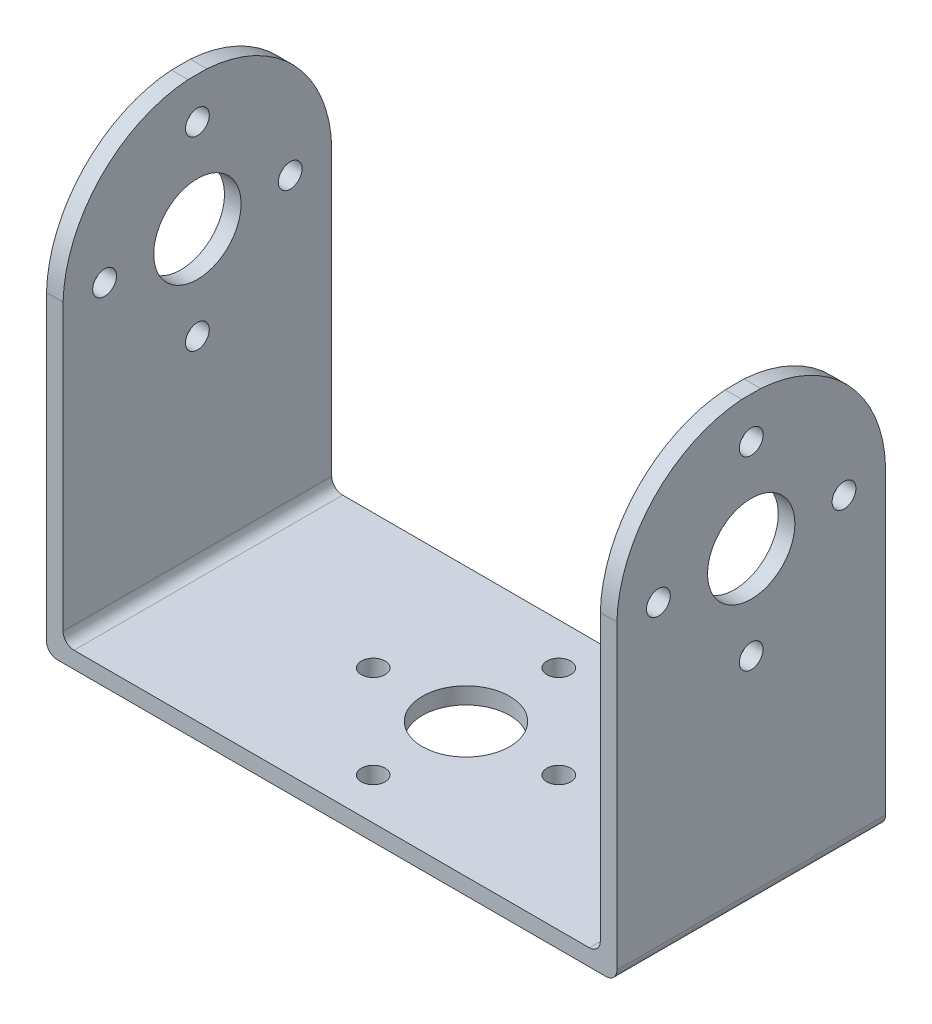
ISO-10303-21;
HEADER;
FILE_DESCRIPTION(('STEP AP214'),'2;1');
FILE_NAME('part.step','',(''),(''),'','','');
FILE_SCHEMA(('AUTOMOTIVE_DESIGN { 1 0 10303 214 1 1 1 1 }'));
ENDSEC;
DATA;
#1=APPLICATION_CONTEXT('core data for automotive mechanical design processes');
#2=APPLICATION_PROTOCOL_DEFINITION('international standard','automotive_design',2000,#1);
#3=PRODUCT_CONTEXT('',#1,'mechanical');
#4=PRODUCT('Part','Part','',(#3));
#5=PRODUCT_RELATED_PRODUCT_CATEGORY('part','',(#4));
#6=PRODUCT_DEFINITION_FORMATION('','',#4);
#7=PRODUCT_DEFINITION_CONTEXT('part definition',#1,'design');
#8=PRODUCT_DEFINITION('design','',#6,#7);
#9=PRODUCT_DEFINITION_SHAPE('','',#8);
#10=(LENGTH_UNIT() NAMED_UNIT(*) SI_UNIT(.MILLI.,.METRE.));
#11=(NAMED_UNIT(*) PLANE_ANGLE_UNIT() SI_UNIT($,.RADIAN.));
#12=(NAMED_UNIT(*) SI_UNIT($,.STERADIAN.) SOLID_ANGLE_UNIT());
#13=UNCERTAINTY_MEASURE_WITH_UNIT(LENGTH_MEASURE(1.E-05),#10,'distance_accuracy_value','');
#14=(GEOMETRIC_REPRESENTATION_CONTEXT(3) GLOBAL_UNCERTAINTY_ASSIGNED_CONTEXT((#13)) GLOBAL_UNIT_ASSIGNED_CONTEXT((#10,
#11,#12)) REPRESENTATION_CONTEXT('',''));
#15=CARTESIAN_POINT('',(0.,0.,0.));
#16=DIRECTION('',(0.,0.,1.));
#17=DIRECTION('',(1.,0.,0.));
#18=AXIS2_PLACEMENT_3D('',#15,#16,#17);
#19=CARTESIAN_POINT('',(0.,0.,24.61));
#20=DIRECTION('',(0.,0.,1.));
#21=DIRECTION('',(1.,0.,0.));
#22=AXIS2_PLACEMENT_3D('',#19,#20,#21);
#23=PLANE('',#22);
#24=DIRECTION('',(1.,0.,0.));
#25=VECTOR('',#24,1.);
#26=CARTESIAN_POINT('',(-26.125,0.,24.61));
#27=LINE('',#26,#25);
#28=CARTESIAN_POINT('',(-25.125,0.,24.61));
#29=VERTEX_POINT('',#28);
#30=CARTESIAN_POINT('',(25.125,0.,24.61));
#31=VERTEX_POINT('',#30);
#32=EDGE_CURVE('E230',#29,#31,#27,.T.);
#33=ORIENTED_EDGE('',*,*,#32,.T.);
#34=CARTESIAN_POINT('',(25.125,1.,24.61));
#35=DIRECTION('',(0.,0.,1.));
#36=DIRECTION('',(1.,0.,0.));
#37=AXIS2_PLACEMENT_3D('',#34,#35,#36);
#38=CIRCLE('',#37,1.);
#39=CARTESIAN_POINT('',(26.125,1.,24.61));
#40=VERTEX_POINT('',#39);
#41=EDGE_CURVE('E303',#31,#40,#38,.T.);
#42=ORIENTED_EDGE('',*,*,#41,.T.);
#43=DIRECTION('',(0.,1.,0.));
#44=VECTOR('',#43,1.);
#45=CARTESIAN_POINT('',(26.125,0.,24.61));
#46=LINE('',#45,#44);
#47=CARTESIAN_POINT('',(26.125,28.630820466906,24.61));
#48=VERTEX_POINT('',#47);
#49=EDGE_CURVE('E234',#40,#48,#46,.T.);
#50=ORIENTED_EDGE('',*,*,#49,.T.);
#51=DIRECTION('',(1.,0.,0.));
#52=VECTOR('',#51,1.);
#53=CARTESIAN_POINT('',(6.125,28.630820466906,24.61));
#54=LINE('',#53,#52);
#55=CARTESIAN_POINT('',(24.605,28.630820466906,24.61));
#56=VERTEX_POINT('',#55);
#57=EDGE_CURVE('E350',#56,#48,#54,.T.);
#58=ORIENTED_EDGE('',*,*,#57,.F.);
#59=DIRECTION('',(0.,-1.,0.));
#60=VECTOR('',#59,1.);
#61=CARTESIAN_POINT('',(24.605,58.34,24.61));
#62=LINE('',#61,#60);
#63=CARTESIAN_POINT('',(24.605,2.52,24.61));
#64=VERTEX_POINT('',#63);
#65=EDGE_CURVE('E236',#56,#64,#62,.T.);
#66=ORIENTED_EDGE('',*,*,#65,.T.);
#67=CARTESIAN_POINT('',(23.605,2.52,24.61));
#68=DIRECTION('',(0.,0.,1.));
#69=DIRECTION('',(1.,0.,0.));
#70=AXIS2_PLACEMENT_3D('',#67,#68,#69);
#71=CIRCLE('',#70,1.);
#72=CARTESIAN_POINT('',(23.605,1.52,24.61));
#73=VERTEX_POINT('',#72);
#74=EDGE_CURVE('E318',#64,#73,#71,.F.);
#75=ORIENTED_EDGE('',*,*,#74,.T.);
#76=DIRECTION('',(-1.,0.,0.));
#77=VECTOR('',#76,1.);
#78=CARTESIAN_POINT('',(24.605,1.52,24.61));
#79=LINE('',#78,#77);
#80=CARTESIAN_POINT('',(-23.605,1.51999999999999,24.61));
#81=VERTEX_POINT('',#80);
#82=EDGE_CURVE('E239',#73,#81,#79,.T.);
#83=ORIENTED_EDGE('',*,*,#82,.T.);
#84=CARTESIAN_POINT('',(-23.605,2.51999999999999,24.61));
#85=DIRECTION('',(0.,0.,1.));
#86=DIRECTION('',(1.,0.,0.));
#87=AXIS2_PLACEMENT_3D('',#84,#85,#86);
#88=CIRCLE('',#87,1.);
#89=CARTESIAN_POINT('',(-24.605,2.51999999999999,24.61));
#90=VERTEX_POINT('',#89);
#91=EDGE_CURVE('E12',#81,#90,#88,.F.);
#92=ORIENTED_EDGE('',*,*,#91,.T.);
#93=DIRECTION('',(0.,1.,0.));
#94=VECTOR('',#93,1.);
#95=CARTESIAN_POINT('',(-24.605,1.51999999999999,24.61));
#96=LINE('',#95,#94);
#97=CARTESIAN_POINT('',(-24.605,28.630820466906,24.61));
#98=VERTEX_POINT('',#97);
#99=EDGE_CURVE('E241',#90,#98,#96,.T.);
#100=ORIENTED_EDGE('',*,*,#99,.T.);
#101=DIRECTION('',(-1.,0.,0.));
#102=VECTOR('',#101,1.);
#103=CARTESIAN_POINT('',(-6.125,28.630820466906,24.61));
#104=LINE('',#103,#102);
#105=CARTESIAN_POINT('',(-26.125,28.630820466906,24.61));
#106=VERTEX_POINT('',#105);
#107=EDGE_CURVE('E257',#98,#106,#104,.T.);
#108=ORIENTED_EDGE('',*,*,#107,.T.);
#109=DIRECTION('',(0.,-1.,0.));
#110=VECTOR('',#109,1.);
#111=CARTESIAN_POINT('',(-26.125,58.34,24.61));
#112=LINE('',#111,#110);
#113=CARTESIAN_POINT('',(-26.125,1.00000000000001,24.61));
#114=VERTEX_POINT('',#113);
#115=EDGE_CURVE('E228',#106,#114,#112,.T.);
#116=ORIENTED_EDGE('',*,*,#115,.T.);
#117=CARTESIAN_POINT('',(-25.125,1.,24.61));
#118=DIRECTION('',(0.,0.,1.));
#119=DIRECTION('',(1.,0.,0.));
#120=AXIS2_PLACEMENT_3D('',#117,#118,#119);
#121=CIRCLE('',#120,1.);
#122=EDGE_CURVE('E301',#114,#29,#121,.T.);
#123=ORIENTED_EDGE('',*,*,#122,.T.);
#124=EDGE_LOOP('',(#33,#42,#50,#58,#66,#75,#83,#92,#100,#108,#116,#123));
#125=FACE_BOUND('',#124,.T.);
#126=ADVANCED_FACE('F82',(#125),#23,.T.);
#127=CARTESIAN_POINT('',(-26.125,58.34,24.61));
#128=DIRECTION('',(1.,0.,0.));
#129=DIRECTION('',(0.,1.,0.));
#130=AXIS2_PLACEMENT_3D('',#127,#128,#129);
#131=PLANE('',#130);
#132=CARTESIAN_POINT('',(-26.125,28.2800000000001,20.805));
#133=DIRECTION('',(-1.,0.,0.));
#134=DIRECTION('',(0.,0.,-1.));
#135=AXIS2_PLACEMENT_3D('',#132,#133,#134);
#136=CIRCLE('',#135,1.09);
#137=CARTESIAN_POINT('',(-26.125,28.2800000000001,19.715));
#138=VERTEX_POINT('',#137);
#139=EDGE_CURVE('E381',#138,#138,#136,.T.);
#140=ORIENTED_EDGE('',*,*,#139,.F.);
#141=EDGE_LOOP('',(#140));
#142=FACE_BOUND('',#141,.T.);
#143=CARTESIAN_POINT('',(-26.125,19.78,12.305));
#144=DIRECTION('',(-1.,0.,0.));
#145=DIRECTION('',(0.,1.,0.));
#146=AXIS2_PLACEMENT_3D('',#143,#144,#145);
#147=CIRCLE('',#146,1.09);
#148=CARTESIAN_POINT('',(-26.125,20.87,12.305));
#149=VERTEX_POINT('',#148);
#150=EDGE_CURVE('E375',#149,#149,#147,.T.);
#151=ORIENTED_EDGE('',*,*,#150,.F.);
#152=EDGE_LOOP('',(#151));
#153=FACE_BOUND('',#152,.T.);
#154=CARTESIAN_POINT('',(-26.125,28.28,3.805));
#155=DIRECTION('',(-1.,0.,0.));
#156=DIRECTION('',(0.,0.,1.));
#157=AXIS2_PLACEMENT_3D('',#154,#155,#156);
#158=CIRCLE('',#157,1.09);
#159=CARTESIAN_POINT('',(-26.125,28.28,4.895));
#160=VERTEX_POINT('',#159);
#161=EDGE_CURVE('E369',#160,#160,#158,.T.);
#162=ORIENTED_EDGE('',*,*,#161,.F.);
#163=EDGE_LOOP('',(#162));
#164=FACE_BOUND('',#163,.T.);
#165=CARTESIAN_POINT('',(-26.125,36.78,12.305));
#166=DIRECTION('',(-1.,0.,0.));
#167=DIRECTION('',(0.,-1.,0.));
#168=AXIS2_PLACEMENT_3D('',#165,#166,#167);
#169=CIRCLE('',#168,1.09);
#170=CARTESIAN_POINT('',(-26.125,35.69,12.305));
#171=VERTEX_POINT('',#170);
#172=EDGE_CURVE('E280',#171,#171,#169,.T.);
#173=ORIENTED_EDGE('',*,*,#172,.F.);
#174=EDGE_LOOP('',(#173));
#175=FACE_BOUND('',#174,.T.);
#176=CARTESIAN_POINT('',(-26.125,28.28,12.305));
#177=DIRECTION('',(-1.,0.,0.));
#178=DIRECTION('',(0.,0.,1.));
#179=AXIS2_PLACEMENT_3D('',#176,#177,#178);
#180=CIRCLE('',#179,4.);
#181=CARTESIAN_POINT('',(-26.125,28.28,16.305));
#182=VERTEX_POINT('',#181);
#183=EDGE_CURVE('E264',#182,#182,#180,.T.);
#184=ORIENTED_EDGE('',*,*,#183,.F.);
#185=EDGE_LOOP('',(#184));
#186=FACE_BOUND('',#185,.T.);
#187=CARTESIAN_POINT('',(-26.125,28.28,12.305));
#188=DIRECTION('',(-1.,0.,0.));
#189=DIRECTION('',(0.,0.,1.));
#190=AXIS2_PLACEMENT_3D('',#187,#188,#189);
#191=CIRCLE('',#190,12.31);
#192=CARTESIAN_POINT('',(-26.125,40.56,13.1638946384744));
#193=VERTEX_POINT('',#192);
#194=EDGE_CURVE('E213',#106,#193,#191,.T.);
#195=ORIENTED_EDGE('',*,*,#194,.T.);
#196=DIRECTION('',(0.,0.,1.));
#197=VECTOR('',#196,1.);
#198=CARTESIAN_POINT('',(-26.125,40.56,0.));
#199=LINE('',#198,#197);
#200=CARTESIAN_POINT('',(-26.125,40.56,11.4461053615256));
#201=VERTEX_POINT('',#200);
#202=EDGE_CURVE('E198',#201,#193,#199,.T.);
#203=ORIENTED_EDGE('',*,*,#202,.F.);
#204=CARTESIAN_POINT('',(-26.125,28.28,12.305));
#205=DIRECTION('',(-1.,0.,0.));
#206=DIRECTION('',(0.,0.,1.));
#207=AXIS2_PLACEMENT_3D('',#204,#205,#206);
#208=CIRCLE('',#207,12.31);
#209=CARTESIAN_POINT('',(-26.125,28.6308204669058,0.));
#210=VERTEX_POINT('',#209);
#211=EDGE_CURVE('E207',#201,#210,#208,.T.);
#212=ORIENTED_EDGE('',*,*,#211,.T.);
#213=DIRECTION('',(0.,-1.,0.));
#214=VECTOR('',#213,1.);
#215=CARTESIAN_POINT('',(-26.125,58.34,0.));
#216=LINE('',#215,#214);
#217=CARTESIAN_POINT('',(-26.125,1.00000000000001,0.));
#218=VERTEX_POINT('',#217);
#219=EDGE_CURVE('E227',#210,#218,#216,.T.);
#220=ORIENTED_EDGE('',*,*,#219,.T.);
#221=DIRECTION('',(0.,0.,-1.));
#222=VECTOR('',#221,1.);
#223=CARTESIAN_POINT('',(-26.125,1.,24.61));
#224=LINE('',#223,#222);
#225=EDGE_CURVE('E97',#218,#114,#224,.F.);
#226=ORIENTED_EDGE('',*,*,#225,.T.);
#227=ORIENTED_EDGE('',*,*,#115,.F.);
#228=EDGE_LOOP('',(#195,#203,#212,#220,#226,#227));
#229=FACE_BOUND('',#228,.T.);
#230=ADVANCED_FACE('F211',(#142,#153,#164,#175,#186,#229),#131,.F.);
#231=CARTESIAN_POINT('',(-24.605,1.51999999999999,24.61));
#232=DIRECTION('',(-1.,0.,0.));
#233=DIRECTION('',(0.,-1.,0.));
#234=AXIS2_PLACEMENT_3D('',#231,#232,#233);
#235=PLANE('',#234);
#236=CARTESIAN_POINT('',(-24.605,28.2800000000001,20.805));
#237=DIRECTION('',(-1.,0.,0.));
#238=DIRECTION('',(0.,0.,-1.));
#239=AXIS2_PLACEMENT_3D('',#236,#237,#238);
#240=CIRCLE('',#239,1.09);
#241=CARTESIAN_POINT('',(-24.605,28.2800000000001,19.715));
#242=VERTEX_POINT('',#241);
#243=EDGE_CURVE('E378',#242,#242,#240,.T.);
#244=ORIENTED_EDGE('',*,*,#243,.T.);
#245=EDGE_LOOP('',(#244));
#246=FACE_BOUND('',#245,.T.);
#247=CARTESIAN_POINT('',(-24.605,19.78,12.305));
#248=DIRECTION('',(-1.,0.,0.));
#249=DIRECTION('',(0.,1.,0.));
#250=AXIS2_PLACEMENT_3D('',#247,#248,#249);
#251=CIRCLE('',#250,1.09);
#252=CARTESIAN_POINT('',(-24.605,20.87,12.305));
#253=VERTEX_POINT('',#252);
#254=EDGE_CURVE('E372',#253,#253,#251,.T.);
#255=ORIENTED_EDGE('',*,*,#254,.T.);
#256=EDGE_LOOP('',(#255));
#257=FACE_BOUND('',#256,.T.);
#258=CARTESIAN_POINT('',(-24.605,28.28,3.805));
#259=DIRECTION('',(-1.,0.,0.));
#260=DIRECTION('',(0.,0.,1.));
#261=AXIS2_PLACEMENT_3D('',#258,#259,#260);
#262=CIRCLE('',#261,1.09);
#263=CARTESIAN_POINT('',(-24.605,28.28,4.895));
#264=VERTEX_POINT('',#263);
#265=EDGE_CURVE('E366',#264,#264,#262,.T.);
#266=ORIENTED_EDGE('',*,*,#265,.T.);
#267=EDGE_LOOP('',(#266));
#268=FACE_BOUND('',#267,.T.);
#269=CARTESIAN_POINT('',(-24.605,36.78,12.305));
#270=DIRECTION('',(-1.,0.,0.));
#271=DIRECTION('',(0.,-1.,0.));
#272=AXIS2_PLACEMENT_3D('',#269,#270,#271);
#273=CIRCLE('',#272,1.09);
#274=CARTESIAN_POINT('',(-24.605,35.69,12.305));
#275=VERTEX_POINT('',#274);
#276=EDGE_CURVE('E359',#275,#275,#273,.T.);
#277=ORIENTED_EDGE('',*,*,#276,.T.);
#278=EDGE_LOOP('',(#277));
#279=FACE_BOUND('',#278,.T.);
#280=CARTESIAN_POINT('',(-24.605,28.28,12.305));
#281=DIRECTION('',(-1.,0.,0.));
#282=DIRECTION('',(0.,-1.,0.));
#283=AXIS2_PLACEMENT_3D('',#280,#281,#282);
#284=CIRCLE('',#283,4.);
#285=CARTESIAN_POINT('',(-24.605,24.28,12.305));
#286=VERTEX_POINT('',#285);
#287=EDGE_CURVE('E261',#286,#286,#284,.T.);
#288=ORIENTED_EDGE('',*,*,#287,.T.);
#289=EDGE_LOOP('',(#288));
#290=FACE_BOUND('',#289,.T.);
#291=CARTESIAN_POINT('',(-24.605,28.28,12.305));
#292=DIRECTION('',(-1.,0.,0.));
#293=DIRECTION('',(0.,-1.,0.));
#294=AXIS2_PLACEMENT_3D('',#291,#292,#293);
#295=CIRCLE('',#294,12.31);
#296=CARTESIAN_POINT('',(-24.605,40.56,11.4461053615257));
#297=VERTEX_POINT('',#296);
#298=CARTESIAN_POINT('',(-24.605,28.6308204669058,0.));
#299=VERTEX_POINT('',#298);
#300=EDGE_CURVE('E206',#297,#299,#295,.T.);
#301=ORIENTED_EDGE('',*,*,#300,.F.);
#302=DIRECTION('',(0.,0.,1.));
#303=VECTOR('',#302,1.);
#304=CARTESIAN_POINT('',(-24.605,40.56,24.61));
#305=LINE('',#304,#303);
#306=CARTESIAN_POINT('',(-24.605,40.56,13.1638946384743));
#307=VERTEX_POINT('',#306);
#308=EDGE_CURVE('E201',#297,#307,#305,.T.);
#309=ORIENTED_EDGE('',*,*,#308,.T.);
#310=CARTESIAN_POINT('',(-24.605,28.28,12.305));
#311=DIRECTION('',(-1.,0.,0.));
#312=DIRECTION('',(0.,-1.,0.));
#313=AXIS2_PLACEMENT_3D('',#310,#311,#312);
#314=CIRCLE('',#313,12.31);
#315=EDGE_CURVE('E219',#98,#307,#314,.T.);
#316=ORIENTED_EDGE('',*,*,#315,.F.);
#317=ORIENTED_EDGE('',*,*,#99,.F.);
#318=DIRECTION('',(0.,0.,-1.));
#319=VECTOR('',#318,1.);
#320=CARTESIAN_POINT('',(-24.605,2.51999999999999,0.));
#321=LINE('',#320,#319);
#322=CARTESIAN_POINT('',(-24.605,2.51999999999999,0.));
#323=VERTEX_POINT('',#322);
#324=EDGE_CURVE('E313',#90,#323,#321,.T.);
#325=ORIENTED_EDGE('',*,*,#324,.T.);
#326=DIRECTION('',(0.,1.,0.));
#327=VECTOR('',#326,1.);
#328=CARTESIAN_POINT('',(-24.605,1.51999999999999,0.));
#329=LINE('',#328,#327);
#330=EDGE_CURVE('E231',#323,#299,#329,.T.);
#331=ORIENTED_EDGE('',*,*,#330,.T.);
#332=EDGE_LOOP('',(#301,#309,#316,#317,#325,#331));
#333=FACE_BOUND('',#332,.T.);
#334=ADVANCED_FACE('F332',(#246,#257,#268,#279,#290,#333),#235,.F.);
#335=CARTESIAN_POINT('',(0.,0.,0.));
#336=DIRECTION('',(0.,0.,1.));
#337=DIRECTION('',(1.,0.,0.));
#338=AXIS2_PLACEMENT_3D('',#335,#336,#337);
#339=PLANE('',#338);
#340=DIRECTION('',(0.,1.,0.));
#341=VECTOR('',#340,1.);
#342=CARTESIAN_POINT('',(26.125,0.,0.));
#343=LINE('',#342,#341);
#344=CARTESIAN_POINT('',(26.125,1.,0.));
#345=VERTEX_POINT('',#344);
#346=CARTESIAN_POINT('',(26.125,28.6308204669059,0.));
#347=VERTEX_POINT('',#346);
#348=EDGE_CURVE('E247',#345,#347,#343,.T.);
#349=ORIENTED_EDGE('',*,*,#348,.F.);
#350=CARTESIAN_POINT('',(25.125,1.,0.));
#351=DIRECTION('',(0.,0.,1.));
#352=DIRECTION('',(1.,0.,0.));
#353=AXIS2_PLACEMENT_3D('',#350,#351,#352);
#354=CIRCLE('',#353,1.);
#355=CARTESIAN_POINT('',(25.125,0.,0.));
#356=VERTEX_POINT('',#355);
#357=EDGE_CURVE('E294',#345,#356,#354,.F.);
#358=ORIENTED_EDGE('',*,*,#357,.T.);
#359=DIRECTION('',(1.,0.,0.));
#360=VECTOR('',#359,1.);
#361=CARTESIAN_POINT('',(-26.125,0.,0.));
#362=LINE('',#361,#360);
#363=CARTESIAN_POINT('',(-25.125,0.,0.));
#364=VERTEX_POINT('',#363);
#365=EDGE_CURVE('E244',#364,#356,#362,.T.);
#366=ORIENTED_EDGE('',*,*,#365,.F.);
#367=CARTESIAN_POINT('',(-25.125,1.,0.));
#368=DIRECTION('',(0.,0.,1.));
#369=DIRECTION('',(1.,0.,0.));
#370=AXIS2_PLACEMENT_3D('',#367,#368,#369);
#371=CIRCLE('',#370,1.);
#372=EDGE_CURVE('E292',#364,#218,#371,.F.);
#373=ORIENTED_EDGE('',*,*,#372,.T.);
#374=ORIENTED_EDGE('',*,*,#219,.F.);
#375=DIRECTION('',(-1.,0.,0.));
#376=VECTOR('',#375,1.);
#377=CARTESIAN_POINT('',(-6.125,28.6308204669058,0.));
#378=LINE('',#377,#376);
#379=EDGE_CURVE('E218',#299,#210,#378,.T.);
#380=ORIENTED_EDGE('',*,*,#379,.F.);
#381=ORIENTED_EDGE('',*,*,#330,.F.);
#382=CARTESIAN_POINT('',(-23.605,2.51999999999999,0.));
#383=DIRECTION('',(0.,0.,1.));
#384=DIRECTION('',(1.,0.,0.));
#385=AXIS2_PLACEMENT_3D('',#382,#383,#384);
#386=CIRCLE('',#385,1.);
#387=CARTESIAN_POINT('',(-23.605,1.51999999999999,0.));
#388=VERTEX_POINT('',#387);
#389=EDGE_CURVE('E90',#323,#388,#386,.T.);
#390=ORIENTED_EDGE('',*,*,#389,.T.);
#391=DIRECTION('',(-1.,0.,0.));
#392=VECTOR('',#391,1.);
#393=CARTESIAN_POINT('',(24.605,1.52,0.));
#394=LINE('',#393,#392);
#395=CARTESIAN_POINT('',(23.605,1.52,0.));
#396=VERTEX_POINT('',#395);
#397=EDGE_CURVE('E252',#396,#388,#394,.T.);
#398=ORIENTED_EDGE('',*,*,#397,.F.);
#399=CARTESIAN_POINT('',(23.605,2.52,0.));
#400=DIRECTION('',(0.,0.,1.));
#401=DIRECTION('',(1.,0.,0.));
#402=AXIS2_PLACEMENT_3D('',#399,#400,#401);
#403=CIRCLE('',#402,1.);
#404=CARTESIAN_POINT('',(24.605,2.52,0.));
#405=VERTEX_POINT('',#404);
#406=EDGE_CURVE('E316',#396,#405,#403,.T.);
#407=ORIENTED_EDGE('',*,*,#406,.T.);
#408=DIRECTION('',(0.,-1.,0.));
#409=VECTOR('',#408,1.);
#410=CARTESIAN_POINT('',(24.605,58.34,0.));
#411=LINE('',#410,#409);
#412=CARTESIAN_POINT('',(24.605,28.6308204669058,0.));
#413=VERTEX_POINT('',#412);
#414=EDGE_CURVE('E249',#413,#405,#411,.T.);
#415=ORIENTED_EDGE('',*,*,#414,.F.);
#416=DIRECTION('',(1.,0.,0.));
#417=VECTOR('',#416,1.);
#418=CARTESIAN_POINT('',(6.125,28.6308204669058,0.));
#419=LINE('',#418,#417);
#420=EDGE_CURVE('E341',#413,#347,#419,.T.);
#421=ORIENTED_EDGE('',*,*,#420,.T.);
#422=EDGE_LOOP('',(#349,#358,#366,#373,#374,#380,#381,#390,#398,#407,#415,#421));
#423=FACE_BOUND('',#422,.T.);
#424=ADVANCED_FACE('F323',(#423),#339,.F.);
#425=CARTESIAN_POINT('',(-26.125,0.,24.61));
#426=DIRECTION('',(0.,1.,0.));
#427=DIRECTION('',(0.,0.,1.));
#428=AXIS2_PLACEMENT_3D('',#425,#426,#427);
#429=PLANE('',#428);
#430=CARTESIAN_POINT('',(-8.49999999999999,0.,12.3049999999999));
#431=DIRECTION('',(0.,1.,0.));
#432=DIRECTION('',(1.,0.,0.));
#433=AXIS2_PLACEMENT_3D('',#430,#431,#432);
#434=CIRCLE('',#433,1.09);
#435=CARTESIAN_POINT('',(-7.40999999999999,0.,12.3049999999999));
#436=VERTEX_POINT('',#435);
#437=EDGE_CURVE('E417',#436,#436,#434,.T.);
#438=ORIENTED_EDGE('',*,*,#437,.T.);
#439=EDGE_LOOP('',(#438));
#440=FACE_BOUND('',#439,.T.);
#441=CARTESIAN_POINT('',(0.,0.,20.805));
#442=DIRECTION('',(0.,1.,0.));
#443=DIRECTION('',(0.,0.,-1.));
#444=AXIS2_PLACEMENT_3D('',#441,#442,#443);
#445=CIRCLE('',#444,1.09);
#446=CARTESIAN_POINT('',(0.,0.,19.715));
#447=VERTEX_POINT('',#446);
#448=EDGE_CURVE('E411',#447,#447,#445,.T.);
#449=ORIENTED_EDGE('',*,*,#448,.T.);
#450=EDGE_LOOP('',(#449));
#451=FACE_BOUND('',#450,.T.);
#452=CARTESIAN_POINT('',(8.50000000000001,0.,12.305));
#453=DIRECTION('',(0.,1.,0.));
#454=DIRECTION('',(-1.,0.,0.));
#455=AXIS2_PLACEMENT_3D('',#452,#453,#454);
#456=CIRCLE('',#455,1.09);
#457=CARTESIAN_POINT('',(7.41000000000001,0.,12.305));
#458=VERTEX_POINT('',#457);
#459=EDGE_CURVE('E289',#458,#458,#456,.T.);
#460=ORIENTED_EDGE('',*,*,#459,.T.);
#461=EDGE_LOOP('',(#460));
#462=FACE_BOUND('',#461,.T.);
#463=CARTESIAN_POINT('',(0.,0.,3.805));
#464=DIRECTION('',(0.,1.,0.));
#465=DIRECTION('',(0.,0.,1.));
#466=AXIS2_PLACEMENT_3D('',#463,#464,#465);
#467=CIRCLE('',#466,1.09);
#468=CARTESIAN_POINT('',(0.,0.,4.895));
#469=VERTEX_POINT('',#468);
#470=EDGE_CURVE('E285',#469,#469,#467,.T.);
#471=ORIENTED_EDGE('',*,*,#470,.T.);
#472=EDGE_LOOP('',(#471));
#473=FACE_BOUND('',#472,.T.);
#474=CARTESIAN_POINT('',(0.,0.,12.305));
#475=DIRECTION('',(0.,1.,0.));
#476=DIRECTION('',(0.,0.,1.));
#477=AXIS2_PLACEMENT_3D('',#474,#475,#476);
#478=CIRCLE('',#477,4.);
#479=CARTESIAN_POINT('',(0.,0.,16.305));
#480=VERTEX_POINT('',#479);
#481=EDGE_CURVE('E284',#480,#480,#478,.T.);
#482=ORIENTED_EDGE('',*,*,#481,.T.);
#483=EDGE_LOOP('',(#482));
#484=FACE_BOUND('',#483,.T.);
#485=ORIENTED_EDGE('',*,*,#365,.T.);
#486=DIRECTION('',(0.,0.,-1.));
#487=VECTOR('',#486,1.);
#488=CARTESIAN_POINT('',(25.125,0.,24.61));
#489=LINE('',#488,#487);
#490=EDGE_CURVE('E299',#356,#31,#489,.F.);
#491=ORIENTED_EDGE('',*,*,#490,.T.);
#492=ORIENTED_EDGE('',*,*,#32,.F.);
#493=DIRECTION('',(0.,0.,-1.));
#494=VECTOR('',#493,1.);
#495=CARTESIAN_POINT('',(-25.125,0.,24.61));
#496=LINE('',#495,#494);
#497=EDGE_CURVE('E296',#29,#364,#496,.T.);
#498=ORIENTED_EDGE('',*,*,#497,.T.);
#499=EDGE_LOOP('',(#485,#491,#492,#498));
#500=FACE_BOUND('',#499,.T.);
#501=ADVANCED_FACE('F470',(#440,#451,#462,#473,#484,#500),#429,.F.);
#502=CARTESIAN_POINT('',(26.125,0.,24.61));
#503=DIRECTION('',(-1.,0.,0.));
#504=DIRECTION('',(0.,-1.,0.));
#505=AXIS2_PLACEMENT_3D('',#502,#503,#504);
#506=PLANE('',#505);
#507=CARTESIAN_POINT('',(26.125,28.2800000000001,20.805));
#508=DIRECTION('',(-1.,0.,0.));
#509=DIRECTION('',(0.,0.,-1.));
#510=AXIS2_PLACEMENT_3D('',#507,#508,#509);
#511=CIRCLE('',#510,1.09);
#512=CARTESIAN_POINT('',(26.125,28.2800000000001,19.715));
#513=VERTEX_POINT('',#512);
#514=EDGE_CURVE('E396',#513,#513,#511,.T.);
#515=ORIENTED_EDGE('',*,*,#514,.T.);
#516=EDGE_LOOP('',(#515));
#517=FACE_BOUND('',#516,.T.);
#518=CARTESIAN_POINT('',(26.125,19.78,12.305));
#519=DIRECTION('',(-1.,0.,0.));
#520=DIRECTION('',(0.,1.,0.));
#521=AXIS2_PLACEMENT_3D('',#518,#519,#520);
#522=CIRCLE('',#521,1.09);
#523=CARTESIAN_POINT('',(26.125,20.87,12.305));
#524=VERTEX_POINT('',#523);
#525=EDGE_CURVE('E390',#524,#524,#522,.T.);
#526=ORIENTED_EDGE('',*,*,#525,.T.);
#527=EDGE_LOOP('',(#526));
#528=FACE_BOUND('',#527,.T.);
#529=CARTESIAN_POINT('',(26.125,28.28,3.80499999999999));
#530=DIRECTION('',(-1.,0.,0.));
#531=DIRECTION('',(0.,0.,1.));
#532=AXIS2_PLACEMENT_3D('',#529,#530,#531);
#533=CIRCLE('',#532,1.09);
#534=CARTESIAN_POINT('',(26.125,28.28,4.89499999999999));
#535=VERTEX_POINT('',#534);
#536=EDGE_CURVE('E384',#535,#535,#533,.T.);
#537=ORIENTED_EDGE('',*,*,#536,.T.);
#538=EDGE_LOOP('',(#537));
#539=FACE_BOUND('',#538,.T.);
#540=CARTESIAN_POINT('',(26.125,36.78,12.305));
#541=DIRECTION('',(-1.,0.,0.));
#542=DIRECTION('',(0.,-1.,0.));
#543=AXIS2_PLACEMENT_3D('',#540,#541,#542);
#544=CIRCLE('',#543,1.09);
#545=CARTESIAN_POINT('',(26.125,35.69,12.305));
#546=VERTEX_POINT('',#545);
#547=EDGE_CURVE('E279',#546,#546,#544,.T.);
#548=ORIENTED_EDGE('',*,*,#547,.T.);
#549=EDGE_LOOP('',(#548));
#550=FACE_BOUND('',#549,.T.);
#551=CARTESIAN_POINT('',(26.125,28.28,12.305));
#552=DIRECTION('',(-1.,0.,0.));
#553=DIRECTION('',(0.,0.,1.));
#554=AXIS2_PLACEMENT_3D('',#551,#552,#553);
#555=CIRCLE('',#554,4.);
#556=CARTESIAN_POINT('',(26.125,28.28,16.305));
#557=VERTEX_POINT('',#556);
#558=EDGE_CURVE('E275',#557,#557,#555,.T.);
#559=ORIENTED_EDGE('',*,*,#558,.T.);
#560=EDGE_LOOP('',(#559));
#561=FACE_BOUND('',#560,.T.);
#562=CARTESIAN_POINT('',(26.125,28.28,12.305));
#563=DIRECTION('',(-1.,0.,0.));
#564=DIRECTION('',(0.,0.,1.));
#565=AXIS2_PLACEMENT_3D('',#562,#563,#564);
#566=CIRCLE('',#565,12.31);
#567=CARTESIAN_POINT('',(26.125,40.56,11.4461053615258));
#568=VERTEX_POINT('',#567);
#569=EDGE_CURVE('E347',#568,#347,#566,.T.);
#570=ORIENTED_EDGE('',*,*,#569,.F.);
#571=DIRECTION('',(0.,0.,1.));
#572=VECTOR('',#571,1.);
#573=CARTESIAN_POINT('',(26.125,40.56,24.61));
#574=LINE('',#573,#572);
#575=CARTESIAN_POINT('',(26.125,40.56,13.1638946384742));
#576=VERTEX_POINT('',#575);
#577=EDGE_CURVE('E424',#568,#576,#574,.T.);
#578=ORIENTED_EDGE('',*,*,#577,.T.);
#579=CARTESIAN_POINT('',(26.125,28.28,12.305));
#580=DIRECTION('',(-1.,0.,0.));
#581=DIRECTION('',(0.,0.,1.));
#582=AXIS2_PLACEMENT_3D('',#579,#580,#581);
#583=CIRCLE('',#582,12.31);
#584=EDGE_CURVE('E274',#48,#576,#583,.T.);
#585=ORIENTED_EDGE('',*,*,#584,.F.);
#586=ORIENTED_EDGE('',*,*,#49,.F.);
#587=DIRECTION('',(0.,0.,-1.));
#588=VECTOR('',#587,1.);
#589=CARTESIAN_POINT('',(26.125,1.,24.61));
#590=LINE('',#589,#588);
#591=EDGE_CURVE('E270',#40,#345,#590,.T.);
#592=ORIENTED_EDGE('',*,*,#591,.T.);
#593=ORIENTED_EDGE('',*,*,#348,.T.);
#594=EDGE_LOOP('',(#570,#578,#585,#586,#592,#593));
#595=FACE_BOUND('',#594,.T.);
#596=ADVANCED_FACE('F448',(#517,#528,#539,#550,#561,#595),#506,.F.);
#597=CARTESIAN_POINT('',(24.605,58.34,24.61));
#598=DIRECTION('',(1.,0.,0.));
#599=DIRECTION('',(0.,1.,0.));
#600=AXIS2_PLACEMENT_3D('',#597,#598,#599);
#601=PLANE('',#600);
#602=CARTESIAN_POINT('',(24.605,28.2800000000001,20.805));
#603=DIRECTION('',(1.,0.,0.));
#604=DIRECTION('',(0.,0.,1.));
#605=AXIS2_PLACEMENT_3D('',#602,#603,#604);
#606=CIRCLE('',#605,1.09);
#607=CARTESIAN_POINT('',(24.605,28.2800000000001,21.895));
#608=VERTEX_POINT('',#607);
#609=EDGE_CURVE('E399',#608,#608,#606,.T.);
#610=ORIENTED_EDGE('',*,*,#609,.T.);
#611=EDGE_LOOP('',(#610));
#612=FACE_BOUND('',#611,.T.);
#613=CARTESIAN_POINT('',(24.605,19.78,12.305));
#614=DIRECTION('',(1.,0.,0.));
#615=DIRECTION('',(0.,-1.,0.));
#616=AXIS2_PLACEMENT_3D('',#613,#614,#615);
#617=CIRCLE('',#616,1.09);
#618=CARTESIAN_POINT('',(24.605,18.69,12.305));
#619=VERTEX_POINT('',#618);
#620=EDGE_CURVE('E393',#619,#619,#617,.T.);
#621=ORIENTED_EDGE('',*,*,#620,.T.);
#622=EDGE_LOOP('',(#621));
#623=FACE_BOUND('',#622,.T.);
#624=CARTESIAN_POINT('',(24.605,28.28,3.80499999999999));
#625=DIRECTION('',(1.,0.,0.));
#626=DIRECTION('',(0.,0.,-1.));
#627=AXIS2_PLACEMENT_3D('',#624,#625,#626);
#628=CIRCLE('',#627,1.09);
#629=CARTESIAN_POINT('',(24.605,28.28,2.71499999999999));
#630=VERTEX_POINT('',#629);
#631=EDGE_CURVE('E387',#630,#630,#628,.T.);
#632=ORIENTED_EDGE('',*,*,#631,.T.);
#633=EDGE_LOOP('',(#632));
#634=FACE_BOUND('',#633,.T.);
#635=CARTESIAN_POINT('',(24.605,36.78,12.305));
#636=DIRECTION('',(1.,0.,0.));
#637=DIRECTION('',(0.,1.,0.));
#638=AXIS2_PLACEMENT_3D('',#635,#636,#637);
#639=CIRCLE('',#638,1.09);
#640=CARTESIAN_POINT('',(24.605,37.87,12.305));
#641=VERTEX_POINT('',#640);
#642=EDGE_CURVE('E276',#641,#641,#639,.T.);
#643=ORIENTED_EDGE('',*,*,#642,.T.);
#644=EDGE_LOOP('',(#643));
#645=FACE_BOUND('',#644,.T.);
#646=CARTESIAN_POINT('',(24.605,28.28,12.305));
#647=DIRECTION('',(1.,0.,0.));
#648=DIRECTION('',(0.,1.,0.));
#649=AXIS2_PLACEMENT_3D('',#646,#647,#648);
#650=CIRCLE('',#649,4.);
#651=CARTESIAN_POINT('',(24.605,32.28,12.305));
#652=VERTEX_POINT('',#651);
#653=EDGE_CURVE('E271',#652,#652,#650,.F.);
#654=ORIENTED_EDGE('',*,*,#653,.F.);
#655=EDGE_LOOP('',(#654));
#656=FACE_BOUND('',#655,.T.);
#657=CARTESIAN_POINT('',(24.605,28.28,12.305));
#658=DIRECTION('',(1.,0.,0.));
#659=DIRECTION('',(0.,1.,0.));
#660=AXIS2_PLACEMENT_3D('',#657,#658,#659);
#661=CIRCLE('',#660,12.31);
#662=CARTESIAN_POINT('',(24.605,40.56,13.1638946384744));
#663=VERTEX_POINT('',#662);
#664=EDGE_CURVE('E267',#56,#663,#661,.F.);
#665=ORIENTED_EDGE('',*,*,#664,.T.);
#666=DIRECTION('',(0.,0.,-1.));
#667=VECTOR('',#666,1.);
#668=CARTESIAN_POINT('',(24.605,40.56,24.61));
#669=LINE('',#668,#667);
#670=CARTESIAN_POINT('',(24.605,40.56,11.4461053615257));
#671=VERTEX_POINT('',#670);
#672=EDGE_CURVE('E214',#663,#671,#669,.T.);
#673=ORIENTED_EDGE('',*,*,#672,.T.);
#674=CARTESIAN_POINT('',(24.605,28.28,12.305));
#675=DIRECTION('',(1.,0.,0.));
#676=DIRECTION('',(0.,1.,0.));
#677=AXIS2_PLACEMENT_3D('',#674,#675,#676);
#678=CIRCLE('',#677,12.31);
#679=EDGE_CURVE('E260',#671,#413,#678,.F.);
#680=ORIENTED_EDGE('',*,*,#679,.T.);
#681=ORIENTED_EDGE('',*,*,#414,.T.);
#682=DIRECTION('',(0.,0.,-1.));
#683=VECTOR('',#682,1.);
#684=CARTESIAN_POINT('',(24.605,2.52,24.61));
#685=LINE('',#684,#683);
#686=EDGE_CURVE('E311',#405,#64,#685,.F.);
#687=ORIENTED_EDGE('',*,*,#686,.T.);
#688=ORIENTED_EDGE('',*,*,#65,.F.);
#689=EDGE_LOOP('',(#665,#673,#680,#681,#687,#688));
#690=FACE_BOUND('',#689,.T.);
#691=ADVANCED_FACE('F430',(#612,#623,#634,#645,#656,#690),#601,.F.);
#692=CARTESIAN_POINT('',(24.605,1.52,24.61));
#693=DIRECTION('',(0.,-1.,0.));
#694=DIRECTION('',(1.,0.,0.));
#695=AXIS2_PLACEMENT_3D('',#692,#693,#694);
#696=PLANE('',#695);
#697=CARTESIAN_POINT('',(-8.49999999999999,1.51999999999999,12.3049999999999));
#698=DIRECTION('',(0.,-1.,0.));
#699=DIRECTION('',(0.,0.,-1.));
#700=AXIS2_PLACEMENT_3D('',#697,#698,#699);
#701=CIRCLE('',#700,1.09);
#702=CARTESIAN_POINT('',(-8.49999999999998,1.51999999999999,11.2149999999999));
#703=VERTEX_POINT('',#702);
#704=EDGE_CURVE('E420',#703,#703,#701,.T.);
#705=ORIENTED_EDGE('',*,*,#704,.T.);
#706=EDGE_LOOP('',(#705));
#707=FACE_BOUND('',#706,.T.);
#708=CARTESIAN_POINT('',(0.,1.51999999999999,20.805));
#709=DIRECTION('',(0.,-1.,0.));
#710=DIRECTION('',(-1.,0.,0.));
#711=AXIS2_PLACEMENT_3D('',#708,#709,#710);
#712=CIRCLE('',#711,1.09);
#713=CARTESIAN_POINT('',(-1.08999999999997,1.51999999999999,20.805));
#714=VERTEX_POINT('',#713);
#715=EDGE_CURVE('E414',#714,#714,#712,.T.);
#716=ORIENTED_EDGE('',*,*,#715,.T.);
#717=EDGE_LOOP('',(#716));
#718=FACE_BOUND('',#717,.T.);
#719=CARTESIAN_POINT('',(8.50000000000001,1.51999999999999,12.305));
#720=DIRECTION('',(0.,-1.,0.));
#721=DIRECTION('',(0.,0.,1.));
#722=AXIS2_PLACEMENT_3D('',#719,#720,#721);
#723=CIRCLE('',#722,1.09);
#724=CARTESIAN_POINT('',(8.50000000000001,1.51999999999999,13.395));
#725=VERTEX_POINT('',#724);
#726=EDGE_CURVE('E408',#725,#725,#723,.T.);
#727=ORIENTED_EDGE('',*,*,#726,.T.);
#728=EDGE_LOOP('',(#727));
#729=FACE_BOUND('',#728,.T.);
#730=CARTESIAN_POINT('',(0.,1.51999999999999,3.805));
#731=DIRECTION('',(0.,-1.,0.));
#732=DIRECTION('',(1.,0.,0.));
#733=AXIS2_PLACEMENT_3D('',#730,#731,#732);
#734=CIRCLE('',#733,1.09);
#735=CARTESIAN_POINT('',(1.09,1.51999999999999,3.805));
#736=VERTEX_POINT('',#735);
#737=EDGE_CURVE('E286',#736,#736,#734,.T.);
#738=ORIENTED_EDGE('',*,*,#737,.T.);
#739=EDGE_LOOP('',(#738));
#740=FACE_BOUND('',#739,.T.);
#741=CARTESIAN_POINT('',(0.,1.52,12.305));
#742=DIRECTION('',(0.,-1.,0.));
#743=DIRECTION('',(1.,0.,0.));
#744=AXIS2_PLACEMENT_3D('',#741,#742,#743);
#745=CIRCLE('',#744,4.);
#746=CARTESIAN_POINT('',(4.00000000000001,1.52,12.305));
#747=VERTEX_POINT('',#746);
#748=EDGE_CURVE('E281',#747,#747,#745,.T.);
#749=ORIENTED_EDGE('',*,*,#748,.T.);
#750=EDGE_LOOP('',(#749));
#751=FACE_BOUND('',#750,.T.);
#752=ORIENTED_EDGE('',*,*,#82,.F.);
#753=DIRECTION('',(0.,0.,-1.));
#754=VECTOR('',#753,1.);
#755=CARTESIAN_POINT('',(23.605,1.52,0.));
#756=LINE('',#755,#754);
#757=EDGE_CURVE('E308',#73,#396,#756,.T.);
#758=ORIENTED_EDGE('',*,*,#757,.T.);
#759=ORIENTED_EDGE('',*,*,#397,.T.);
#760=DIRECTION('',(0.,0.,-1.));
#761=VECTOR('',#760,1.);
#762=CARTESIAN_POINT('',(-23.605,1.51999999999999,24.61));
#763=LINE('',#762,#761);
#764=EDGE_CURVE('E306',#388,#81,#763,.F.);
#765=ORIENTED_EDGE('',*,*,#764,.T.);
#766=EDGE_LOOP('',(#752,#758,#759,#765));
#767=FACE_BOUND('',#766,.T.);
#768=ADVANCED_FACE('F329',(#707,#718,#729,#740,#751,#767),#696,.F.);
#769=CARTESIAN_POINT('',(-6.125,28.28,12.305));
#770=DIRECTION('',(-1.,0.,0.));
#771=DIRECTION('',(0.,-1.,0.));
#772=AXIS2_PLACEMENT_3D('',#769,#770,#771);
#773=CYLINDRICAL_SURFACE('',#772,12.31);
#774=ORIENTED_EDGE('',*,*,#300,.T.);
#775=ORIENTED_EDGE('',*,*,#379,.T.);
#776=ORIENTED_EDGE('',*,*,#211,.F.);
#777=DIRECTION('',(-1.,0.,0.));
#778=VECTOR('',#777,1.);
#779=CARTESIAN_POINT('',(-6.125,40.56,11.4461053615256));
#780=LINE('',#779,#778);
#781=EDGE_CURVE('E195',#297,#201,#780,.T.);
#782=ORIENTED_EDGE('',*,*,#781,.F.);
#783=EDGE_LOOP('',(#774,#775,#776,#782));
#784=FACE_BOUND('',#783,.T.);
#785=ADVANCED_FACE('F216',(#784),#773,.T.);
#786=CARTESIAN_POINT('',(-6.125,28.28,12.305));
#787=DIRECTION('',(-1.,0.,0.));
#788=DIRECTION('',(0.,-1.,0.));
#789=AXIS2_PLACEMENT_3D('',#786,#787,#788);
#790=CYLINDRICAL_SURFACE('',#789,12.31);
#791=ORIENTED_EDGE('',*,*,#315,.T.);
#792=DIRECTION('',(-1.,0.,0.));
#793=VECTOR('',#792,1.);
#794=CARTESIAN_POINT('',(-6.125,40.56,13.1638946384744));
#795=LINE('',#794,#793);
#796=EDGE_CURVE('E222',#307,#193,#795,.T.);
#797=ORIENTED_EDGE('',*,*,#796,.T.);
#798=ORIENTED_EDGE('',*,*,#194,.F.);
#799=ORIENTED_EDGE('',*,*,#107,.F.);
#800=EDGE_LOOP('',(#791,#797,#798,#799));
#801=FACE_BOUND('',#800,.T.);
#802=ADVANCED_FACE('F336',(#801),#790,.T.);
#803=CARTESIAN_POINT('',(-6.125,28.28,12.305));
#804=DIRECTION('',(-1.,0.,0.));
#805=DIRECTION('',(0.,-1.,0.));
#806=AXIS2_PLACEMENT_3D('',#803,#804,#805);
#807=CYLINDRICAL_SURFACE('',#806,4.);
#808=ORIENTED_EDGE('',*,*,#183,.T.);
#809=EDGE_LOOP('',(#808));
#810=FACE_BOUND('',#809,.T.);
#811=ORIENTED_EDGE('',*,*,#287,.F.);
#812=EDGE_LOOP('',(#811));
#813=FACE_BOUND('',#812,.T.);
#814=ADVANCED_FACE('F547',(#810,#813),#807,.F.);
#815=CARTESIAN_POINT('',(6.125,28.28,12.305));
#816=DIRECTION('',(1.,0.,0.));
#817=DIRECTION('',(0.,1.,0.));
#818=AXIS2_PLACEMENT_3D('',#815,#816,#817);
#819=CYLINDRICAL_SURFACE('',#818,12.31);
#820=ORIENTED_EDGE('',*,*,#679,.F.);
#821=DIRECTION('',(1.,0.,0.));
#822=VECTOR('',#821,1.);
#823=CARTESIAN_POINT('',(6.125,40.56,11.4461053615256));
#824=LINE('',#823,#822);
#825=EDGE_CURVE('E344',#671,#568,#824,.T.);
#826=ORIENTED_EDGE('',*,*,#825,.T.);
#827=ORIENTED_EDGE('',*,*,#569,.T.);
#828=ORIENTED_EDGE('',*,*,#420,.F.);
#829=EDGE_LOOP('',(#820,#826,#827,#828));
#830=FACE_BOUND('',#829,.T.);
#831=ADVANCED_FACE('F436',(#830),#819,.T.);
#832=CARTESIAN_POINT('',(6.125,28.28,12.305));
#833=DIRECTION('',(1.,0.,0.));
#834=DIRECTION('',(0.,1.,0.));
#835=AXIS2_PLACEMENT_3D('',#832,#833,#834);
#836=CYLINDRICAL_SURFACE('',#835,12.31);
#837=ORIENTED_EDGE('',*,*,#57,.T.);
#838=ORIENTED_EDGE('',*,*,#584,.T.);
#839=DIRECTION('',(1.,0.,0.));
#840=VECTOR('',#839,1.);
#841=CARTESIAN_POINT('',(6.125,40.56,13.1638946384744));
#842=LINE('',#841,#840);
#843=EDGE_CURVE('E353',#663,#576,#842,.T.);
#844=ORIENTED_EDGE('',*,*,#843,.F.);
#845=ORIENTED_EDGE('',*,*,#664,.F.);
#846=EDGE_LOOP('',(#837,#838,#844,#845));
#847=FACE_BOUND('',#846,.T.);
#848=ADVANCED_FACE('F446',(#847),#836,.T.);
#849=CARTESIAN_POINT('',(6.125,28.28,12.305));
#850=DIRECTION('',(1.,0.,0.));
#851=DIRECTION('',(0.,1.,0.));
#852=AXIS2_PLACEMENT_3D('',#849,#850,#851);
#853=CYLINDRICAL_SURFACE('',#852,4.);
#854=ORIENTED_EDGE('',*,*,#558,.F.);
#855=EDGE_LOOP('',(#854));
#856=FACE_BOUND('',#855,.T.);
#857=ORIENTED_EDGE('',*,*,#653,.T.);
#858=EDGE_LOOP('',(#857));
#859=FACE_BOUND('',#858,.T.);
#860=ADVANCED_FACE('F565',(#856,#859),#853,.F.);
#861=CARTESIAN_POINT('',(73.875,36.78,12.305));
#862=DIRECTION('',(-1.,0.,0.));
#863=DIRECTION('',(0.,-1.,0.));
#864=AXIS2_PLACEMENT_3D('',#861,#862,#863);
#865=CYLINDRICAL_SURFACE('',#864,1.09);
#866=ORIENTED_EDGE('',*,*,#642,.F.);
#867=EDGE_LOOP('',(#866));
#868=FACE_BOUND('',#867,.T.);
#869=ORIENTED_EDGE('',*,*,#547,.F.);
#870=EDGE_LOOP('',(#869));
#871=FACE_BOUND('',#870,.T.);
#872=ADVANCED_FACE('F584',(#868,#871),#865,.F.);
#873=ORIENTED_EDGE('',*,*,#172,.T.);
#874=EDGE_LOOP('',(#873));
#875=FACE_BOUND('',#874,.T.);
#876=ORIENTED_EDGE('',*,*,#276,.F.);
#877=EDGE_LOOP('',(#876));
#878=FACE_BOUND('',#877,.T.);
#879=ADVANCED_FACE('F592',(#875,#878),#865,.F.);
#880=CARTESIAN_POINT('',(73.875,28.28,3.80499999999999));
#881=DIRECTION('',(-1.,0.,0.));
#882=DIRECTION('',(0.,0.,1.));
#883=AXIS2_PLACEMENT_3D('',#880,#881,#882);
#884=CYLINDRICAL_SURFACE('',#883,1.09);
#885=ORIENTED_EDGE('',*,*,#161,.T.);
#886=EDGE_LOOP('',(#885));
#887=FACE_BOUND('',#886,.T.);
#888=ORIENTED_EDGE('',*,*,#265,.F.);
#889=EDGE_LOOP('',(#888));
#890=FACE_BOUND('',#889,.T.);
#891=ADVANCED_FACE('F600',(#887,#890),#884,.F.);
#892=CARTESIAN_POINT('',(73.875,19.78,12.305));
#893=DIRECTION('',(-1.,0.,0.));
#894=DIRECTION('',(0.,1.,0.));
#895=AXIS2_PLACEMENT_3D('',#892,#893,#894);
#896=CYLINDRICAL_SURFACE('',#895,1.09);
#897=ORIENTED_EDGE('',*,*,#150,.T.);
#898=EDGE_LOOP('',(#897));
#899=FACE_BOUND('',#898,.T.);
#900=ORIENTED_EDGE('',*,*,#254,.F.);
#901=EDGE_LOOP('',(#900));
#902=FACE_BOUND('',#901,.T.);
#903=ADVANCED_FACE('F607',(#899,#902),#896,.F.);
#904=CARTESIAN_POINT('',(73.875,28.2800000000001,20.805));
#905=DIRECTION('',(-1.,0.,0.));
#906=DIRECTION('',(0.,0.,-1.));
#907=AXIS2_PLACEMENT_3D('',#904,#905,#906);
#908=CYLINDRICAL_SURFACE('',#907,1.09);
#909=ORIENTED_EDGE('',*,*,#139,.T.);
#910=EDGE_LOOP('',(#909));
#911=FACE_BOUND('',#910,.T.);
#912=ORIENTED_EDGE('',*,*,#243,.F.);
#913=EDGE_LOOP('',(#912));
#914=FACE_BOUND('',#913,.T.);
#915=ADVANCED_FACE('F615',(#911,#914),#908,.F.);
#916=CARTESIAN_POINT('',(73.875,28.28,3.80499999999999));
#917=DIRECTION('',(-1.,0.,0.));
#918=DIRECTION('',(0.,0.,1.));
#919=AXIS2_PLACEMENT_3D('',#916,#917,#918);
#920=CYLINDRICAL_SURFACE('',#919,1.09);
#921=ORIENTED_EDGE('',*,*,#631,.F.);
#922=EDGE_LOOP('',(#921));
#923=FACE_BOUND('',#922,.T.);
#924=ORIENTED_EDGE('',*,*,#536,.F.);
#925=EDGE_LOOP('',(#924));
#926=FACE_BOUND('',#925,.T.);
#927=ADVANCED_FACE('F623',(#923,#926),#920,.F.);
#928=CARTESIAN_POINT('',(73.875,19.78,12.305));
#929=DIRECTION('',(-1.,0.,0.));
#930=DIRECTION('',(0.,1.,0.));
#931=AXIS2_PLACEMENT_3D('',#928,#929,#930);
#932=CYLINDRICAL_SURFACE('',#931,1.09);
#933=ORIENTED_EDGE('',*,*,#620,.F.);
#934=EDGE_LOOP('',(#933));
#935=FACE_BOUND('',#934,.T.);
#936=ORIENTED_EDGE('',*,*,#525,.F.);
#937=EDGE_LOOP('',(#936));
#938=FACE_BOUND('',#937,.T.);
#939=ADVANCED_FACE('F631',(#935,#938),#932,.F.);
#940=CARTESIAN_POINT('',(73.875,28.2800000000001,20.805));
#941=DIRECTION('',(-1.,0.,0.));
#942=DIRECTION('',(0.,0.,-1.));
#943=AXIS2_PLACEMENT_3D('',#940,#941,#942);
#944=CYLINDRICAL_SURFACE('',#943,1.09);
#945=ORIENTED_EDGE('',*,*,#609,.F.);
#946=EDGE_LOOP('',(#945));
#947=FACE_BOUND('',#946,.T.);
#948=ORIENTED_EDGE('',*,*,#514,.F.);
#949=EDGE_LOOP('',(#948));
#950=FACE_BOUND('',#949,.T.);
#951=ADVANCED_FACE('F639',(#947,#950),#944,.F.);
#952=CARTESIAN_POINT('',(0.,-48.48,12.305));
#953=DIRECTION('',(0.,1.,0.));
#954=DIRECTION('',(-1.,0.,0.));
#955=AXIS2_PLACEMENT_3D('',#952,#953,#954);
#956=CYLINDRICAL_SURFACE('',#955,4.);
#957=ORIENTED_EDGE('',*,*,#748,.F.);
#958=EDGE_LOOP('',(#957));
#959=FACE_BOUND('',#958,.T.);
#960=ORIENTED_EDGE('',*,*,#481,.F.);
#961=EDGE_LOOP('',(#960));
#962=FACE_BOUND('',#961,.T.);
#963=ADVANCED_FACE('F647',(#959,#962),#956,.F.);
#964=CARTESIAN_POINT('',(0.,-48.48,3.805));
#965=DIRECTION('',(0.,1.,0.));
#966=DIRECTION('',(-1.,0.,0.));
#967=AXIS2_PLACEMENT_3D('',#964,#965,#966);
#968=CYLINDRICAL_SURFACE('',#967,1.09);
#969=ORIENTED_EDGE('',*,*,#737,.F.);
#970=EDGE_LOOP('',(#969));
#971=FACE_BOUND('',#970,.T.);
#972=ORIENTED_EDGE('',*,*,#470,.F.);
#973=EDGE_LOOP('',(#972));
#974=FACE_BOUND('',#973,.T.);
#975=ADVANCED_FACE('F655',(#971,#974),#968,.F.);
#976=CARTESIAN_POINT('',(8.50000000000002,-48.48,12.305));
#977=DIRECTION('',(0.,1.,0.));
#978=DIRECTION('',(0.,0.,-1.));
#979=AXIS2_PLACEMENT_3D('',#976,#977,#978);
#980=CYLINDRICAL_SURFACE('',#979,1.09);
#981=ORIENTED_EDGE('',*,*,#726,.F.);
#982=EDGE_LOOP('',(#981));
#983=FACE_BOUND('',#982,.T.);
#984=ORIENTED_EDGE('',*,*,#459,.F.);
#985=EDGE_LOOP('',(#984));
#986=FACE_BOUND('',#985,.T.);
#987=ADVANCED_FACE('F663',(#983,#986),#980,.F.);
#988=CARTESIAN_POINT('',(0.,-48.48,20.805));
#989=DIRECTION('',(0.,1.,0.));
#990=DIRECTION('',(1.,0.,0.));
#991=AXIS2_PLACEMENT_3D('',#988,#989,#990);
#992=CYLINDRICAL_SURFACE('',#991,1.09);
#993=ORIENTED_EDGE('',*,*,#715,.F.);
#994=EDGE_LOOP('',(#993));
#995=FACE_BOUND('',#994,.T.);
#996=ORIENTED_EDGE('',*,*,#448,.F.);
#997=EDGE_LOOP('',(#996));
#998=FACE_BOUND('',#997,.T.);
#999=ADVANCED_FACE('F671',(#995,#998),#992,.F.);
#1000=CARTESIAN_POINT('',(-8.49999999999998,-48.48,12.3049999999999));
#1001=DIRECTION('',(0.,1.,0.));
#1002=DIRECTION('',(0.,0.,1.));
#1003=AXIS2_PLACEMENT_3D('',#1000,#1001,#1002);
#1004=CYLINDRICAL_SURFACE('',#1003,1.09);
#1005=ORIENTED_EDGE('',*,*,#704,.F.);
#1006=EDGE_LOOP('',(#1005));
#1007=FACE_BOUND('',#1006,.T.);
#1008=ORIENTED_EDGE('',*,*,#437,.F.);
#1009=EDGE_LOOP('',(#1008));
#1010=FACE_BOUND('',#1009,.T.);
#1011=ADVANCED_FACE('F490',(#1007,#1010),#1004,.F.);
#1012=CARTESIAN_POINT('',(25.125,1.,24.61));
#1013=DIRECTION('',(0.,0.,-1.));
#1014=DIRECTION('',(-1.,0.,0.));
#1015=AXIS2_PLACEMENT_3D('',#1012,#1013,#1014);
#1016=CYLINDRICAL_SURFACE('',#1015,1.);
#1017=ORIENTED_EDGE('',*,*,#41,.F.);
#1018=ORIENTED_EDGE('',*,*,#490,.F.);
#1019=ORIENTED_EDGE('',*,*,#357,.F.);
#1020=ORIENTED_EDGE('',*,*,#591,.F.);
#1021=EDGE_LOOP('',(#1017,#1018,#1019,#1020));
#1022=FACE_BOUND('',#1021,.T.);
#1023=ADVANCED_FACE('F486',(#1022),#1016,.T.);
#1024=CARTESIAN_POINT('',(-25.125,1.,24.61));
#1025=DIRECTION('',(0.,0.,-1.));
#1026=DIRECTION('',(-1.,0.,0.));
#1027=AXIS2_PLACEMENT_3D('',#1024,#1025,#1026);
#1028=CYLINDRICAL_SURFACE('',#1027,1.);
#1029=ORIENTED_EDGE('',*,*,#122,.F.);
#1030=ORIENTED_EDGE('',*,*,#225,.F.);
#1031=ORIENTED_EDGE('',*,*,#372,.F.);
#1032=ORIENTED_EDGE('',*,*,#497,.F.);
#1033=EDGE_LOOP('',(#1029,#1030,#1031,#1032));
#1034=FACE_BOUND('',#1033,.T.);
#1035=ADVANCED_FACE('F489',(#1034),#1028,.T.);
#1036=CARTESIAN_POINT('',(23.605,2.52,24.61));
#1037=DIRECTION('',(0.,0.,1.));
#1038=DIRECTION('',(1.,0.,0.));
#1039=AXIS2_PLACEMENT_3D('',#1036,#1037,#1038);
#1040=CYLINDRICAL_SURFACE('',#1039,1.);
#1041=ORIENTED_EDGE('',*,*,#74,.F.);
#1042=ORIENTED_EDGE('',*,*,#686,.F.);
#1043=ORIENTED_EDGE('',*,*,#406,.F.);
#1044=ORIENTED_EDGE('',*,*,#757,.F.);
#1045=EDGE_LOOP('',(#1041,#1042,#1043,#1044));
#1046=FACE_BOUND('',#1045,.T.);
#1047=ADVANCED_FACE('F441',(#1046),#1040,.F.);
#1048=CARTESIAN_POINT('',(-23.605,2.51999999999999,24.61));
#1049=DIRECTION('',(0.,0.,1.));
#1050=DIRECTION('',(1.,0.,0.));
#1051=AXIS2_PLACEMENT_3D('',#1048,#1049,#1050);
#1052=CYLINDRICAL_SURFACE('',#1051,1.);
#1053=ORIENTED_EDGE('',*,*,#91,.F.);
#1054=ORIENTED_EDGE('',*,*,#764,.F.);
#1055=ORIENTED_EDGE('',*,*,#389,.F.);
#1056=ORIENTED_EDGE('',*,*,#324,.F.);
#1057=EDGE_LOOP('',(#1053,#1054,#1055,#1056));
#1058=FACE_BOUND('',#1057,.T.);
#1059=ADVANCED_FACE('F84',(#1058),#1052,.F.);
#1060=CARTESIAN_POINT('',(73.875,40.56,0.));
#1061=DIRECTION('',(0.,-1.,0.));
#1062=DIRECTION('',(0.,0.,-1.));
#1063=AXIS2_PLACEMENT_3D('',#1060,#1061,#1062);
#1064=PLANE('',#1063);
#1065=ORIENTED_EDGE('',*,*,#825,.F.);
#1066=ORIENTED_EDGE('',*,*,#672,.F.);
#1067=ORIENTED_EDGE('',*,*,#843,.T.);
#1068=ORIENTED_EDGE('',*,*,#577,.F.);
#1069=EDGE_LOOP('',(#1065,#1066,#1067,#1068));
#1070=FACE_BOUND('',#1069,.T.);
#1071=ADVANCED_FACE('F450',(#1070),#1064,.F.);
#1072=ORIENTED_EDGE('',*,*,#781,.T.);
#1073=ORIENTED_EDGE('',*,*,#202,.T.);
#1074=ORIENTED_EDGE('',*,*,#796,.F.);
#1075=ORIENTED_EDGE('',*,*,#308,.F.);
#1076=EDGE_LOOP('',(#1072,#1073,#1074,#1075));
#1077=FACE_BOUND('',#1076,.T.);
#1078=ADVANCED_FACE('F197',(#1077),#1064,.F.);
#1079=CLOSED_SHELL('',(#126,#230,#334,#424,#501,#596,#691,#768,#785,#802,#814,#831,#848,#860,
#872,#879,#891,#903,#915,#927,#939,#951,#963,#975,#987,#999,#1011,#1023,#1035,#1047,#1059,#1071,#1078));
#1080=MANIFOLD_SOLID_BREP('B2',#1079);
#1081=ADVANCED_BREP_SHAPE_REPRESENTATION('',(#18,#1080),#14);
#1082=SHAPE_DEFINITION_REPRESENTATION(#9,#1081);
ENDSEC;
END-ISO-10303-21;
